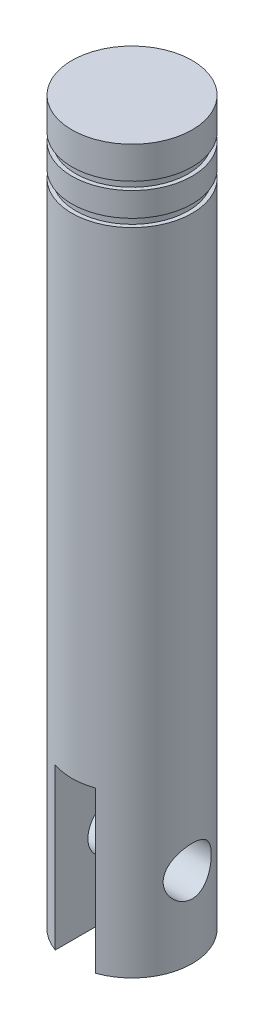
ISO-10303-21;
HEADER;
FILE_DESCRIPTION(('STEP AP214'),'2;1');
FILE_NAME('part.step','',(''),(''),'','','');
FILE_SCHEMA(('AUTOMOTIVE_DESIGN { 1 0 10303 214 1 1 1 1 }'));
ENDSEC;
DATA;
#1=APPLICATION_CONTEXT('core data for automotive mechanical design processes');
#2=APPLICATION_PROTOCOL_DEFINITION('international standard','automotive_design',2000,#1);
#3=PRODUCT_CONTEXT('',#1,'mechanical');
#4=PRODUCT('Part','Part','',(#3));
#5=PRODUCT_RELATED_PRODUCT_CATEGORY('part','',(#4));
#6=PRODUCT_DEFINITION_FORMATION('','',#4);
#7=PRODUCT_DEFINITION_CONTEXT('part definition',#1,'design');
#8=PRODUCT_DEFINITION('design','',#6,#7);
#9=PRODUCT_DEFINITION_SHAPE('','',#8);
#10=(LENGTH_UNIT() NAMED_UNIT(*) SI_UNIT(.MILLI.,.METRE.));
#11=(NAMED_UNIT(*) PLANE_ANGLE_UNIT() SI_UNIT($,.RADIAN.));
#12=(NAMED_UNIT(*) SI_UNIT($,.STERADIAN.) SOLID_ANGLE_UNIT());
#13=UNCERTAINTY_MEASURE_WITH_UNIT(LENGTH_MEASURE(1.E-05),#10,'distance_accuracy_value','');
#14=(GEOMETRIC_REPRESENTATION_CONTEXT(3) GLOBAL_UNCERTAINTY_ASSIGNED_CONTEXT((#13)) GLOBAL_UNIT_ASSIGNED_CONTEXT((#10,
#11,#12)) REPRESENTATION_CONTEXT('',''));
#15=CARTESIAN_POINT('',(0.,0.,0.));
#16=DIRECTION('',(0.,0.,1.));
#17=DIRECTION('',(1.,0.,0.));
#18=AXIS2_PLACEMENT_3D('',#15,#16,#17);
#19=CARTESIAN_POINT('',(-7.5,-45.,0.));
#20=DIRECTION('',(0.,1.,0.));
#21=DIRECTION('',(-1.,0.,0.));
#22=AXIS2_PLACEMENT_3D('',#19,#20,#21);
#23=PLANE('',#22);
#24=CARTESIAN_POINT('',(0.,-45.,0.));
#25=DIRECTION('',(0.,-1.,0.));
#26=DIRECTION('',(1.,0.,0.));
#27=AXIS2_PLACEMENT_3D('',#24,#25,#26);
#28=CIRCLE('',#27,7.5);
#29=CARTESIAN_POINT('',(-2.50000000000002,-45.,7.07106781186547));
#30=VERTEX_POINT('',#29);
#31=CARTESIAN_POINT('',(-2.50000000000002,-45.,-7.07106781186547));
#32=VERTEX_POINT('',#31);
#33=EDGE_CURVE('E91',#30,#32,#28,.T.);
#34=ORIENTED_EDGE('',*,*,#33,.T.);
#35=DIRECTION('',(0.,0.,1.));
#36=VECTOR('',#35,1.);
#37=CARTESIAN_POINT('',(-2.50000000000002,-45.,-7.5));
#38=LINE('',#37,#36);
#39=EDGE_CURVE('E76',#32,#30,#38,.T.);
#40=ORIENTED_EDGE('',*,*,#39,.T.);
#41=EDGE_LOOP('',(#34,#40));
#42=FACE_BOUND('',#41,.T.);
#43=ADVANCED_FACE('F35',(#42),#23,.F.);
#44=CARTESIAN_POINT('',(-7.50000000000002,41.,0.));
#45=DIRECTION('',(0.,1.,0.));
#46=DIRECTION('',(-1.,0.,0.));
#47=AXIS2_PLACEMENT_3D('',#44,#45,#46);
#48=PLANE('',#47);
#49=CARTESIAN_POINT('',(0.,41.,0.));
#50=DIRECTION('',(0.,-1.,0.));
#51=DIRECTION('',(1.,0.,0.));
#52=AXIS2_PLACEMENT_3D('',#49,#50,#51);
#53=CIRCLE('',#52,6.99999999999999);
#54=CARTESIAN_POINT('',(6.99999999999997,41.,0.));
#55=VERTEX_POINT('',#54);
#56=EDGE_CURVE('E122',#55,#55,#53,.T.);
#57=ORIENTED_EDGE('',*,*,#56,.F.);
#58=EDGE_LOOP('',(#57));
#59=FACE_BOUND('',#58,.T.);
#60=CARTESIAN_POINT('',(0.,41.,0.));
#61=DIRECTION('',(0.,-1.,0.));
#62=DIRECTION('',(1.,0.,0.));
#63=AXIS2_PLACEMENT_3D('',#60,#61,#62);
#64=CIRCLE('',#63,7.5);
#65=CARTESIAN_POINT('',(7.49999999999998,41.,0.));
#66=VERTEX_POINT('',#65);
#67=EDGE_CURVE('E98',#66,#66,#64,.T.);
#68=ORIENTED_EDGE('',*,*,#67,.T.);
#69=EDGE_LOOP('',(#68));
#70=FACE_BOUND('',#69,.T.);
#71=ADVANCED_FACE('F37',(#59,#70),#48,.F.);
#72=CARTESIAN_POINT('',(0.,-45.,0.));
#73=DIRECTION('',(0.,-1.,0.));
#74=DIRECTION('',(1.,0.,0.));
#75=AXIS2_PLACEMENT_3D('',#72,#73,#74);
#76=CYLINDRICAL_SURFACE('',#75,7.5);
#77=ORIENTED_EDGE('',*,*,#67,.F.);
#78=EDGE_LOOP('',(#77));
#79=FACE_BOUND('',#78,.T.);
#80=CARTESIAN_POINT('',(0.,45.,0.));
#81=DIRECTION('',(0.,-1.,0.));
#82=DIRECTION('',(1.,0.,0.));
#83=AXIS2_PLACEMENT_3D('',#80,#81,#82);
#84=CIRCLE('',#83,7.5);
#85=CARTESIAN_POINT('',(7.49999999999998,45.,0.));
#86=VERTEX_POINT('',#85);
#87=EDGE_CURVE('E94',#86,#86,#84,.T.);
#88=ORIENTED_EDGE('',*,*,#87,.T.);
#89=EDGE_LOOP('',(#88));
#90=FACE_BOUND('',#89,.T.);
#91=ADVANCED_FACE('F161',(#79,#90),#76,.T.);
#92=CARTESIAN_POINT('',(0.,45.,0.));
#93=DIRECTION('',(0.,-1.,0.));
#94=DIRECTION('',(1.,0.,0.));
#95=AXIS2_PLACEMENT_3D('',#92,#93,#94);
#96=PLANE('',#95);
#97=ORIENTED_EDGE('',*,*,#87,.F.);
#98=EDGE_LOOP('',(#97));
#99=FACE_BOUND('',#98,.T.);
#100=ADVANCED_FACE('F165',(#99),#96,.F.);
#101=CARTESIAN_POINT('',(2.49999999999999,-45.,-7.07106781186548));
#102=VERTEX_POINT('',#101);
#103=CARTESIAN_POINT('',(2.49999999999999,-45.,7.07106781186548));
#104=VERTEX_POINT('',#103);
#105=EDGE_CURVE('E95',#102,#104,#28,.T.);
#106=ORIENTED_EDGE('',*,*,#105,.T.);
#107=DIRECTION('',(0.,0.,1.));
#108=VECTOR('',#107,1.);
#109=CARTESIAN_POINT('',(2.49999999999999,-45.,-7.5));
#110=LINE('',#109,#108);
#111=EDGE_CURVE('E85',#102,#104,#110,.T.);
#112=ORIENTED_EDGE('',*,*,#111,.F.);
#113=EDGE_LOOP('',(#106,#112));
#114=FACE_BOUND('',#113,.T.);
#115=ADVANCED_FACE('F116',(#114),#23,.F.);
#116=CARTESIAN_POINT('',(0.,-45.,0.));
#117=DIRECTION('',(0.,-1.,0.));
#118=DIRECTION('',(1.,0.,0.));
#119=AXIS2_PLACEMENT_3D('',#116,#117,#118);
#120=CYLINDRICAL_SURFACE('',#119,7.5);
#121=CARTESIAN_POINT('',(-7.50000000000002,-38.,0.));
#122=CARTESIAN_POINT('',(-7.49999888970474,-37.9999983890229,-0.0806632009395351));
#123=CARTESIAN_POINT('',(-7.49869368950071,-37.99674011548,-0.161354413498371));
#124=CARTESIAN_POINT('',(-7.49351186176526,-37.9837470954671,-0.322146094522251));
#125=CARTESIAN_POINT('',(-7.48963361174619,-37.9740082625401,-0.40224615798198));
#126=CARTESIAN_POINT('',(-7.47424634808758,-37.9351288598822,-0.641096781067451));
#127=CARTESIAN_POINT('',(-7.45898522266243,-37.8963256924552,-0.798158082521719));
#128=CARTESIAN_POINT('',(-7.42011459126984,-37.7946857721891,-1.1024703389988));
#129=CARTESIAN_POINT('',(-7.39653243529675,-37.7319277009698,-1.24975157753076));
#130=CARTESIAN_POINT('',(-7.3433487722407,-37.584471269705,-1.53159737405796));
#131=CARTESIAN_POINT('',(-7.31374935540466,-37.4997805257342,-1.66616632427491));
#132=CARTESIAN_POINT('',(-7.24996340359365,-37.3066467436976,-1.92525452632722));
#133=CARTESIAN_POINT('',(-7.2156344837394,-37.1973400133687,-2.04909421803168));
#134=CARTESIAN_POINT('',(-7.14690862377685,-36.9598999970569,-2.27726169757605));
#135=CARTESIAN_POINT('',(-7.11251165865922,-36.8317575548035,-2.38157993941976));
#136=CARTESIAN_POINT('',(-7.04584188546733,-36.5533578939878,-2.5723120820679));
#137=CARTESIAN_POINT('',(-7.01373174174386,-36.4023702707912,-2.65772253361338));
#138=CARTESIAN_POINT('',(-6.95750470553339,-36.0866954025439,-2.80163201676496));
#139=CARTESIAN_POINT('',(-6.93338401809298,-35.9220147082749,-2.86014383023324));
#140=CARTESIAN_POINT('',(-6.89739536545611,-35.5914314995665,-2.94584825055478));
#141=CARTESIAN_POINT('',(-6.88502130539266,-35.4259231466171,-2.974340952837));
#142=CARTESIAN_POINT('',(-6.87246006067861,-35.0920475025576,-3.00325943833355));
#143=CARTESIAN_POINT('',(-6.87226688315068,-34.9236816580913,-3.00369902341367));
#144=CARTESIAN_POINT('',(-6.88365750391268,-34.6013649927747,-2.97748405223856));
#145=CARTESIAN_POINT('',(-6.89442262441714,-34.4472264282761,-2.95271297167583));
#146=CARTESIAN_POINT('',(-6.92514281294202,-34.1455106658869,-2.87992032013237));
#147=CARTESIAN_POINT('',(-6.94509948450628,-33.9979346178108,-2.83189469212407));
#148=CARTESIAN_POINT('',(-6.99239227665172,-33.7099732457397,-2.71304209891513));
#149=CARTESIAN_POINT('',(-7.0198706892988,-33.569796141427,-2.64176979349676));
#150=CARTESIAN_POINT('',(-7.07907174576134,-33.3028762754486,-2.47875969107453));
#151=CARTESIAN_POINT('',(-7.11079598182861,-33.1761385858933,-2.38701420764467));
#152=CARTESIAN_POINT('',(-7.17790105116005,-32.9293854067997,-2.17732589918876));
#153=CARTESIAN_POINT('',(-7.21337497464925,-32.8106469058317,-2.05790619445786));
#154=CARTESIAN_POINT('',(-7.28189737436727,-32.5944732829962,-1.80047164114339));
#155=CARTESIAN_POINT('',(-7.31494536667799,-32.4970424038844,-1.66245309800114));
#156=CARTESIAN_POINT('',(-7.37572021897015,-32.3245738288764,-1.3681164789093));
#157=CARTESIAN_POINT('',(-7.40332905143174,-32.2500165782045,-1.21149073701986));
#158=CARTESIAN_POINT('',(-7.44922242493088,-32.1287482083829,-0.88653564822419));
#159=CARTESIAN_POINT('',(-7.46751170193561,-32.0820229436639,-0.718212295274483));
#160=CARTESIAN_POINT('',(-7.49184209260379,-32.0203275568705,-0.385343831411762));
#161=CARTESIAN_POINT('',(-7.49854418750275,-32.0036413186196,-0.221164940978296));
#162=CARTESIAN_POINT('',(-7.50102717765944,-31.9974303492071,0.107767964711716));
#163=CARTESIAN_POINT('',(-7.49681090373438,-32.0078985776787,0.272521819835822));
#164=CARTESIAN_POINT('',(-7.4783635059563,-32.054437628828,0.59014910868304));
#165=CARTESIAN_POINT('',(-7.46459087018284,-32.0893369705264,0.743223737663436));
#166=CARTESIAN_POINT('',(-7.42889162108252,-32.1821535624648,1.04120314209094));
#167=CARTESIAN_POINT('',(-7.40696396034804,-32.2400737695033,1.18610686533642));
#168=CARTESIAN_POINT('',(-7.35624892156211,-32.3791774095196,1.46861817872592));
#169=CARTESIAN_POINT('',(-7.32727223969677,-32.4610182080636,1.60586703413639));
#170=CARTESIAN_POINT('',(-7.26560047118316,-32.6449104858595,1.86516538686655));
#171=CARTESIAN_POINT('',(-7.23290389665513,-32.746970064388,1.98720876112943));
#172=CARTESIAN_POINT('',(-7.16467676457054,-32.9763050194201,2.22108456455631));
#173=CARTESIAN_POINT('',(-7.1291016213714,-33.1048003122427,2.3317109007594));
#174=CARTESIAN_POINT('',(-7.06112509376138,-33.3791601245307,2.53012679607026));
#175=CARTESIAN_POINT('',(-7.02872423291409,-33.5250275005721,2.6179125918181));
#176=CARTESIAN_POINT('',(-6.97071449859906,-33.8321925418284,2.76871125308743));
#177=CARTESIAN_POINT('',(-6.94517446320967,-33.993625998583,2.83147589251401));
#178=CARTESIAN_POINT('',(-6.90485510223109,-34.326100477808,2.92844432884615));
#179=CARTESIAN_POINT('',(-6.89006783567177,-34.4971343095966,2.96266920524751));
#180=CARTESIAN_POINT('',(-6.87407638928379,-34.830691851847,2.9995734283829));
#181=CARTESIAN_POINT('',(-6.87197131434659,-34.9929422564508,3.00434563234764));
#182=CARTESIAN_POINT('',(-6.87922254127235,-35.3158172895088,2.98770473002408));
#183=CARTESIAN_POINT('',(-6.88857738776019,-35.4764421217941,2.96629494876878));
#184=CARTESIAN_POINT('',(-6.91689973341125,-35.784998274275,2.89960708102334));
#185=CARTESIAN_POINT('',(-6.93547246725062,-35.9331803731612,2.85530635681061));
#186=CARTESIAN_POINT('',(-6.97986002865438,-36.2200679829191,2.7450080562502));
#187=CARTESIAN_POINT('',(-7.00567685597585,-36.3587708638532,2.67900448789151));
#188=CARTESIAN_POINT('',(-7.06347910401243,-36.6314142771862,2.52280960319953));
#189=CARTESIAN_POINT('',(-7.09573308125318,-36.7646274239758,2.43144976133989));
#190=CARTESIAN_POINT('',(-7.16195721907533,-37.014490557201,2.2288364197758));
#191=CARTESIAN_POINT('',(-7.1959278947067,-37.1311355323133,2.1175769239766));
#192=CARTESIAN_POINT('',(-7.2644028951161,-37.3523019648148,1.86976526416226));
#193=CARTESIAN_POINT('',(-7.29879901943986,-37.4555470590559,1.73204093441049));
#194=CARTESIAN_POINT('',(-7.36200845178942,-37.6375144693551,1.43982353523661));
#195=CARTESIAN_POINT('',(-7.39081916114846,-37.7162253809562,1.28532271229705));
#196=CARTESIAN_POINT('',(-7.42714827886078,-37.8130735008888,1.04589046292377));
#197=CARTESIAN_POINT('',(-7.438042523706,-37.841655970124,0.965550642326299));
#198=CARTESIAN_POINT('',(-7.45739623794253,-37.8919376582943,0.802472015195128));
#199=CARTESIAN_POINT('',(-7.46585684248286,-37.9136400868448,0.719734347003784));
#200=CARTESIAN_POINT('',(-7.48007543500346,-37.9498820309638,0.552707555877389));
#201=CARTESIAN_POINT('',(-7.48584027408326,-37.9644397091379,0.468422937872988));
#202=CARTESIAN_POINT('',(-7.49452509406316,-37.9863036527915,0.298814608941239));
#203=CARTESIAN_POINT('',(-7.49744709693401,-37.9936150722507,0.213491680311736));
#204=CARTESIAN_POINT('',(-7.49963590220857,-37.9990895204053,0.0853730051865994));
#205=CARTESIAN_POINT('',(-7.50000058761589,-38.0000008525982,0.0426904255930861));
#206=CARTESIAN_POINT('',(-7.50000000000002,-38.,0.));
#207=B_SPLINE_CURVE_WITH_KNOTS('',3,(#121,#122,#123,#124,#125,#126,#127,#128,#129,#130,#131,
#132,#133,#134,#135,#136,#137,#138,#139,#140,#141,#142,#143,#144,#145,#146,#147,#148,#149,#150,
#151,#152,#153,#154,#155,#156,#157,#158,#159,#160,#161,#162,#163,#164,#165,#166,#167,#168,#169,
#170,#171,#172,#173,#174,#175,#176,#177,#178,#179,#180,#181,#182,#183,#184,#185,#186,#187,#188,
#189,#190,#191,#192,#193,#194,#195,#196,#197,#198,#199,#200,#201,#202,#203,#204,#205,#206),
.UNSPECIFIED.,.T.,.F.,(4,2,2,2,2,2,2,2,2,2,2,2,2,2,2,2,2,2,2,2,2,2,2,2,2,2,2,2,2,2,2,2,2,2,2,2,
2,2,2,2,2,2,4),(0.,0.241952995066614,0.484058703589859,0.968979675762155,1.45232140795762,
1.93549552527002,2.43941494725621,2.94358014576643,3.47018310403851,3.99653556852428,
4.49901580138269,5.00124881685758,5.46852914780512,5.93589103065598,6.4127911162975,
6.88987055088801,7.40382945961361,7.91789061441125,8.44210791925736,8.96605856352212,
9.45899198973538,9.9517976253665,10.4224610552808,10.8931849567222,11.3783069227892,
11.8636236142998,12.3809813411815,12.8984242574715,13.4208798989277,13.9429493115043,
14.4274493227065,14.911887810261,15.3771690000468,15.8425787588927,16.3346362426657,
16.8268422420412,17.3509605748228,17.8753221764233,18.1329380344125,18.3904335342851,
18.6472710222664,18.9039257004316,19.0319776028183),.UNSPECIFIED.);
#208=CARTESIAN_POINT('',(-7.50000000000002,-38.,0.));
#209=VERTEX_POINT('',#208);
#210=EDGE_CURVE('E307',#209,#209,#207,.T.);
#211=ORIENTED_EDGE('',*,*,#210,.T.);
#212=EDGE_LOOP('',(#211));
#213=FACE_BOUND('',#212,.T.);
#214=CARTESIAN_POINT('',(7.5,-32.,0.));
#215=CARTESIAN_POINT('',(7.49999888970472,-32.0000016109771,-0.0806632009395355));
#216=CARTESIAN_POINT('',(7.49869368950069,-32.00325988452,-0.161354413498372));
#217=CARTESIAN_POINT('',(7.49351186176526,-32.0162529045329,-0.322146094522252));
#218=CARTESIAN_POINT('',(7.48963361174618,-32.0259917374599,-0.402246157981982));
#219=CARTESIAN_POINT('',(7.47424634808757,-32.0648711401178,-0.641096781067452));
#220=CARTESIAN_POINT('',(7.45898522266242,-32.1036743075448,-0.798158082521719));
#221=CARTESIAN_POINT('',(7.42011459126983,-32.2053142278109,-1.1024703389988));
#222=CARTESIAN_POINT('',(7.39653243529674,-32.2680722990302,-1.24975157753076));
#223=CARTESIAN_POINT('',(7.34334877224069,-32.415528730295,-1.53159737405796));
#224=CARTESIAN_POINT('',(7.31374935540466,-32.5002194742658,-1.66616632427491));
#225=CARTESIAN_POINT('',(7.24996340359364,-32.6933532563024,-1.92525452632722));
#226=CARTESIAN_POINT('',(7.21563448373939,-32.8026599866313,-2.04909421803168));
#227=CARTESIAN_POINT('',(7.14690862377684,-33.0401000029431,-2.27726169757605));
#228=CARTESIAN_POINT('',(7.11251165865921,-33.1682424451965,-2.38157993941976));
#229=CARTESIAN_POINT('',(7.04584188546732,-33.4466421060121,-2.5723120820679));
#230=CARTESIAN_POINT('',(7.01373174174385,-33.5976297292088,-2.65772253361338));
#231=CARTESIAN_POINT('',(6.95750470553338,-33.9133045974561,-2.80163201676496));
#232=CARTESIAN_POINT('',(6.93338401809297,-34.0779852917251,-2.86014383023324));
#233=CARTESIAN_POINT('',(6.8973953654561,-34.4085685004334,-2.94584825055478));
#234=CARTESIAN_POINT('',(6.88502130539265,-34.5740768533829,-2.974340952837));
#235=CARTESIAN_POINT('',(6.87246006067861,-34.9079524974424,-3.00325943833355));
#236=CARTESIAN_POINT('',(6.87226688315067,-35.0763183419086,-3.00369902341367));
#237=CARTESIAN_POINT('',(6.88365750391267,-35.3986350072253,-2.97748405223856));
#238=CARTESIAN_POINT('',(6.89442262441713,-35.5527735717239,-2.95271297167583));
#239=CARTESIAN_POINT('',(6.92514281294201,-35.8544893341131,-2.87992032013237));
#240=CARTESIAN_POINT('',(6.94509948450627,-36.0020653821892,-2.83189469212407));
#241=CARTESIAN_POINT('',(6.99239227665171,-36.2900267542603,-2.71304209891513));
#242=CARTESIAN_POINT('',(7.01987068929879,-36.430203858573,-2.64176979349676));
#243=CARTESIAN_POINT('',(7.07907174576133,-36.6971237245514,-2.47875969107453));
#244=CARTESIAN_POINT('',(7.1107959818286,-36.8238614141067,-2.38701420764467));
#245=CARTESIAN_POINT('',(7.17790105116004,-37.0706145932003,-2.17732589918876));
#246=CARTESIAN_POINT('',(7.21337497464924,-37.1893530941683,-2.05790619445786));
#247=CARTESIAN_POINT('',(7.28189737436726,-37.4055267170038,-1.80047164114339));
#248=CARTESIAN_POINT('',(7.31494536667798,-37.5029575961156,-1.66245309800114));
#249=CARTESIAN_POINT('',(7.37572021897014,-37.6754261711235,-1.3681164789093));
#250=CARTESIAN_POINT('',(7.40332905143173,-37.7499834217955,-1.21149073701986));
#251=CARTESIAN_POINT('',(7.44922242493087,-37.8712517916171,-0.886535648224189));
#252=CARTESIAN_POINT('',(7.4675117019356,-37.9179770563361,-0.718212295274483));
#253=CARTESIAN_POINT('',(7.49184209260378,-37.9796724431295,-0.385343831411762));
#254=CARTESIAN_POINT('',(7.49854418750274,-37.9963586813803,-0.221164940978296));
#255=CARTESIAN_POINT('',(7.50102717765943,-38.0025696507929,0.107767964711716));
#256=CARTESIAN_POINT('',(7.49681090373437,-37.9921014223212,0.272521819835822));
#257=CARTESIAN_POINT('',(7.4783635059563,-37.945562371172,0.590149108683039));
#258=CARTESIAN_POINT('',(7.46459087018283,-37.9106630294736,0.743223737663435));
#259=CARTESIAN_POINT('',(7.42889162108251,-37.8178464375352,1.04120314209094));
#260=CARTESIAN_POINT('',(7.40696396034803,-37.7599262304967,1.18610686533642));
#261=CARTESIAN_POINT('',(7.3562489215621,-37.6208225904804,1.46861817872592));
#262=CARTESIAN_POINT('',(7.32727223969676,-37.5389817919364,1.60586703413639));
#263=CARTESIAN_POINT('',(7.26560047118315,-37.3550895141404,1.86516538686655));
#264=CARTESIAN_POINT('',(7.23290389665512,-37.253029935612,1.98720876112942));
#265=CARTESIAN_POINT('',(7.16467676457053,-37.0236949805799,2.2210845645563));
#266=CARTESIAN_POINT('',(7.12910162137139,-36.8951996877573,2.3317109007594));
#267=CARTESIAN_POINT('',(7.06112509376137,-36.6208398754693,2.53012679607026));
#268=CARTESIAN_POINT('',(7.02872423291408,-36.4749724994279,2.6179125918181));
#269=CARTESIAN_POINT('',(6.97071449859905,-36.1678074581716,2.76871125308743));
#270=CARTESIAN_POINT('',(6.94517446320966,-36.006374001417,2.83147589251401));
#271=CARTESIAN_POINT('',(6.90485510223108,-35.673899522192,2.92844432884615));
#272=CARTESIAN_POINT('',(6.89006783567176,-35.5028656904034,2.96266920524751));
#273=CARTESIAN_POINT('',(6.87407638928378,-35.169308148153,2.9995734283829));
#274=CARTESIAN_POINT('',(6.87197131434659,-35.0070577435492,3.00434563234764));
#275=CARTESIAN_POINT('',(6.87922254127235,-34.6841827104912,2.98770473002408));
#276=CARTESIAN_POINT('',(6.88857738776018,-34.5235578782059,2.96629494876878));
#277=CARTESIAN_POINT('',(6.91689973341124,-34.215001725725,2.89960708102334));
#278=CARTESIAN_POINT('',(6.93547246725061,-34.0668196268387,2.85530635681061));
#279=CARTESIAN_POINT('',(6.97986002865438,-33.7799320170809,2.7450080562502));
#280=CARTESIAN_POINT('',(7.00567685597584,-33.6412291361468,2.67900448789151));
#281=CARTESIAN_POINT('',(7.06347910401242,-33.3685857228138,2.52280960319953));
#282=CARTESIAN_POINT('',(7.09573308125317,-33.2353725760242,2.43144976133989));
#283=CARTESIAN_POINT('',(7.16195721907533,-32.985509442799,2.2288364197758));
#284=CARTESIAN_POINT('',(7.1959278947067,-32.8688644676867,2.1175769239766));
#285=CARTESIAN_POINT('',(7.26440289511609,-32.6476980351852,1.86976526416226));
#286=CARTESIAN_POINT('',(7.29879901943985,-32.544452940944,1.73204093441049));
#287=CARTESIAN_POINT('',(7.36200845178942,-32.3624855306449,1.43982353523661));
#288=CARTESIAN_POINT('',(7.39081916114845,-32.2837746190438,1.28532271229705));
#289=CARTESIAN_POINT('',(7.42714827886077,-32.1869264991112,1.04589046292377));
#290=CARTESIAN_POINT('',(7.438042523706,-32.158344029876,0.965550642326299));
#291=CARTESIAN_POINT('',(7.45739623794252,-32.1080623417057,0.802472015195128));
#292=CARTESIAN_POINT('',(7.46585684248285,-32.0863599131552,0.719734347003783));
#293=CARTESIAN_POINT('',(7.48007543500346,-32.0501179690362,0.552707555877388));
#294=CARTESIAN_POINT('',(7.48584027408325,-32.0355602908621,0.468422937872989));
#295=CARTESIAN_POINT('',(7.49452509406316,-32.0136963472085,0.29881460894124));
#296=CARTESIAN_POINT('',(7.49744709693401,-32.0063849277493,0.213491680311737));
#297=CARTESIAN_POINT('',(7.49963590220856,-32.0009104795947,0.0853730051866004));
#298=CARTESIAN_POINT('',(7.50000058761588,-31.9999991474018,0.0426904255930866));
#299=CARTESIAN_POINT('',(7.5,-32.,0.));
#300=B_SPLINE_CURVE_WITH_KNOTS('',3,(#214,#215,#216,#217,#218,#219,#220,#221,#222,#223,#224,
#225,#226,#227,#228,#229,#230,#231,#232,#233,#234,#235,#236,#237,#238,#239,#240,#241,#242,#243,
#244,#245,#246,#247,#248,#249,#250,#251,#252,#253,#254,#255,#256,#257,#258,#259,#260,#261,#262,
#263,#264,#265,#266,#267,#268,#269,#270,#271,#272,#273,#274,#275,#276,#277,#278,#279,#280,#281,
#282,#283,#284,#285,#286,#287,#288,#289,#290,#291,#292,#293,#294,#295,#296,#297,#298,#299),
.UNSPECIFIED.,.T.,.F.,(4,2,2,2,2,2,2,2,2,2,2,2,2,2,2,2,2,2,2,2,2,2,2,2,2,2,2,2,2,2,2,2,2,2,2,2,
2,2,2,2,2,2,4),(0.,0.241952995066615,0.48405870358986,0.968979675762156,1.45232140795762,
1.93549552527002,2.43941494725621,2.94358014576643,3.47018310403851,3.99653556852428,
4.49901580138269,5.00124881685758,5.46852914780512,5.93589103065598,6.4127911162975,
6.88987055088801,7.40382945961361,7.91789061441125,8.44210791925736,8.96605856352212,
9.45899198973538,9.9517976253665,10.4224610552808,10.8931849567222,11.3783069227892,
11.8636236142998,12.3809813411815,12.8984242574715,13.4208798989277,13.9429493115043,
14.4274493227065,14.911887810261,15.3771690000468,15.8425787588927,16.3346362426657,
16.8268422420412,17.3509605748228,17.8753221764233,18.1329380344125,18.3904335342851,
18.6472710222664,18.9039257004316,19.0319776028183),.UNSPECIFIED.);
#301=CARTESIAN_POINT('',(7.5,-32.,0.));
#302=VERTEX_POINT('',#301);
#303=EDGE_CURVE('E86',#302,#302,#300,.T.);
#304=ORIENTED_EDGE('',*,*,#303,.T.);
#305=EDGE_LOOP('',(#304));
#306=FACE_BOUND('',#305,.T.);
#307=CARTESIAN_POINT('',(0.,-25.,0.));
#308=DIRECTION('',(0.,1.,0.));
#309=DIRECTION('',(0.,0.,1.));
#310=AXIS2_PLACEMENT_3D('',#307,#308,#309);
#311=CIRCLE('',#310,7.5);
#312=CARTESIAN_POINT('',(-2.50000000000002,-25.,7.07106781186547));
#313=VERTEX_POINT('',#312);
#314=CARTESIAN_POINT('',(2.49999999999998,-25.,7.07106781186548));
#315=VERTEX_POINT('',#314);
#316=EDGE_CURVE('E56',#313,#315,#311,.T.);
#317=ORIENTED_EDGE('',*,*,#316,.T.);
#318=DIRECTION('',(0.,-1.,0.));
#319=VECTOR('',#318,1.);
#320=CARTESIAN_POINT('',(2.49999999999999,-45.,7.07106781186548));
#321=LINE('',#320,#319);
#322=EDGE_CURVE('E11',#315,#104,#321,.T.);
#323=ORIENTED_EDGE('',*,*,#322,.T.);
#324=ORIENTED_EDGE('',*,*,#105,.F.);
#325=DIRECTION('',(0.,-1.,0.));
#326=VECTOR('',#325,1.);
#327=CARTESIAN_POINT('',(2.49999999999999,-45.,-7.07106781186548));
#328=LINE('',#327,#326);
#329=CARTESIAN_POINT('',(2.49999999999999,-25.,-7.07106781186548));
#330=VERTEX_POINT('',#329);
#331=EDGE_CURVE('E44',#102,#330,#328,.F.);
#332=ORIENTED_EDGE('',*,*,#331,.T.);
#333=CARTESIAN_POINT('',(-2.50000000000002,-25.,-7.07106781186547));
#334=VERTEX_POINT('',#333);
#335=EDGE_CURVE('E51',#330,#334,#311,.T.);
#336=ORIENTED_EDGE('',*,*,#335,.T.);
#337=DIRECTION('',(0.,-1.,0.));
#338=VECTOR('',#337,1.);
#339=CARTESIAN_POINT('',(-2.50000000000002,-45.,-7.07106781186547));
#340=LINE('',#339,#338);
#341=EDGE_CURVE('E79',#334,#32,#340,.T.);
#342=ORIENTED_EDGE('',*,*,#341,.T.);
#343=ORIENTED_EDGE('',*,*,#33,.F.);
#344=DIRECTION('',(0.,-1.,0.));
#345=VECTOR('',#344,1.);
#346=CARTESIAN_POINT('',(-2.50000000000002,-45.,7.07106781186547));
#347=LINE('',#346,#345);
#348=EDGE_CURVE('E81',#30,#313,#347,.F.);
#349=ORIENTED_EDGE('',*,*,#348,.T.);
#350=EDGE_LOOP('',(#317,#323,#324,#332,#336,#342,#343,#349));
#351=FACE_BOUND('',#350,.T.);
#352=CARTESIAN_POINT('',(0.,36.,0.));
#353=DIRECTION('',(0.,-1.,0.));
#354=DIRECTION('',(1.,0.,0.));
#355=AXIS2_PLACEMENT_3D('',#352,#353,#354);
#356=CIRCLE('',#355,7.5);
#357=CARTESIAN_POINT('',(7.49999999999998,36.,0.));
#358=VERTEX_POINT('',#357);
#359=EDGE_CURVE('E101',#358,#358,#356,.T.);
#360=ORIENTED_EDGE('',*,*,#359,.T.);
#361=EDGE_LOOP('',(#360));
#362=FACE_BOUND('',#361,.T.);
#363=ADVANCED_FACE('F89',(#213,#306,#351,#362),#120,.T.);
#364=CARTESIAN_POINT('',(-7.,36.,0.));
#365=DIRECTION('',(0.,-1.,0.));
#366=DIRECTION('',(1.,0.,0.));
#367=AXIS2_PLACEMENT_3D('',#364,#365,#366);
#368=PLANE('',#367);
#369=ORIENTED_EDGE('',*,*,#359,.F.);
#370=EDGE_LOOP('',(#369));
#371=FACE_BOUND('',#370,.T.);
#372=CARTESIAN_POINT('',(0.,36.,0.));
#373=DIRECTION('',(0.,-1.,0.));
#374=DIRECTION('',(1.,0.,0.));
#375=AXIS2_PLACEMENT_3D('',#372,#373,#374);
#376=CIRCLE('',#375,6.99999999999999);
#377=CARTESIAN_POINT('',(6.99999999999997,36.,0.));
#378=VERTEX_POINT('',#377);
#379=EDGE_CURVE('E136',#378,#378,#376,.T.);
#380=ORIENTED_EDGE('',*,*,#379,.T.);
#381=EDGE_LOOP('',(#380));
#382=FACE_BOUND('',#381,.T.);
#383=ADVANCED_FACE('F143',(#371,#382),#368,.F.);
#384=CARTESIAN_POINT('',(0.,-45.,0.));
#385=DIRECTION('',(0.,-1.,0.));
#386=DIRECTION('',(1.,0.,0.));
#387=AXIS2_PLACEMENT_3D('',#384,#385,#386);
#388=CYLINDRICAL_SURFACE('',#387,6.99999999999999);
#389=ORIENTED_EDGE('',*,*,#379,.F.);
#390=EDGE_LOOP('',(#389));
#391=FACE_BOUND('',#390,.T.);
#392=CARTESIAN_POINT('',(0.,37.,0.));
#393=DIRECTION('',(0.,-1.,0.));
#394=DIRECTION('',(1.,0.,0.));
#395=AXIS2_PLACEMENT_3D('',#392,#393,#394);
#396=CIRCLE('',#395,6.99999999999999);
#397=CARTESIAN_POINT('',(6.99999999999997,37.,0.));
#398=VERTEX_POINT('',#397);
#399=EDGE_CURVE('E134',#398,#398,#396,.T.);
#400=ORIENTED_EDGE('',*,*,#399,.T.);
#401=EDGE_LOOP('',(#400));
#402=FACE_BOUND('',#401,.T.);
#403=ADVANCED_FACE('F145',(#391,#402),#388,.T.);
#404=CARTESIAN_POINT('',(-7.50000000000002,37.,0.));
#405=DIRECTION('',(0.,1.,0.));
#406=DIRECTION('',(-1.,0.,0.));
#407=AXIS2_PLACEMENT_3D('',#404,#405,#406);
#408=PLANE('',#407);
#409=ORIENTED_EDGE('',*,*,#399,.F.);
#410=EDGE_LOOP('',(#409));
#411=FACE_BOUND('',#410,.T.);
#412=CARTESIAN_POINT('',(0.,37.,0.));
#413=DIRECTION('',(0.,-1.,0.));
#414=DIRECTION('',(1.,0.,0.));
#415=AXIS2_PLACEMENT_3D('',#412,#413,#414);
#416=CIRCLE('',#415,7.5);
#417=CARTESIAN_POINT('',(7.49999999999998,37.,0.));
#418=VERTEX_POINT('',#417);
#419=EDGE_CURVE('E131',#418,#418,#416,.T.);
#420=ORIENTED_EDGE('',*,*,#419,.T.);
#421=EDGE_LOOP('',(#420));
#422=FACE_BOUND('',#421,.T.);
#423=ADVANCED_FACE('F151',(#411,#422),#408,.F.);
#424=CARTESIAN_POINT('',(0.,-45.,0.));
#425=DIRECTION('',(0.,-1.,0.));
#426=DIRECTION('',(1.,0.,0.));
#427=AXIS2_PLACEMENT_3D('',#424,#425,#426);
#428=CYLINDRICAL_SURFACE('',#427,7.5);
#429=ORIENTED_EDGE('',*,*,#419,.F.);
#430=EDGE_LOOP('',(#429));
#431=FACE_BOUND('',#430,.T.);
#432=CARTESIAN_POINT('',(0.,40.,0.));
#433=DIRECTION('',(0.,-1.,0.));
#434=DIRECTION('',(1.,0.,0.));
#435=AXIS2_PLACEMENT_3D('',#432,#433,#434);
#436=CIRCLE('',#435,7.5);
#437=CARTESIAN_POINT('',(7.49999999999998,40.,0.));
#438=VERTEX_POINT('',#437);
#439=EDGE_CURVE('E128',#438,#438,#436,.T.);
#440=ORIENTED_EDGE('',*,*,#439,.T.);
#441=EDGE_LOOP('',(#440));
#442=FACE_BOUND('',#441,.T.);
#443=ADVANCED_FACE('F220',(#431,#442),#428,.T.);
#444=CARTESIAN_POINT('',(-7.,40.,0.));
#445=DIRECTION('',(0.,-1.,0.));
#446=DIRECTION('',(1.,0.,0.));
#447=AXIS2_PLACEMENT_3D('',#444,#445,#446);
#448=PLANE('',#447);
#449=ORIENTED_EDGE('',*,*,#439,.F.);
#450=EDGE_LOOP('',(#449));
#451=FACE_BOUND('',#450,.T.);
#452=CARTESIAN_POINT('',(0.,40.,0.));
#453=DIRECTION('',(0.,-1.,0.));
#454=DIRECTION('',(1.,0.,0.));
#455=AXIS2_PLACEMENT_3D('',#452,#453,#454);
#456=CIRCLE('',#455,6.99999999999999);
#457=CARTESIAN_POINT('',(6.99999999999997,40.,0.));
#458=VERTEX_POINT('',#457);
#459=EDGE_CURVE('E125',#458,#458,#456,.T.);
#460=ORIENTED_EDGE('',*,*,#459,.T.);
#461=EDGE_LOOP('',(#460));
#462=FACE_BOUND('',#461,.T.);
#463=ADVANCED_FACE('F229',(#451,#462),#448,.F.);
#464=CARTESIAN_POINT('',(0.,-45.,0.));
#465=DIRECTION('',(0.,-1.,0.));
#466=DIRECTION('',(1.,0.,0.));
#467=AXIS2_PLACEMENT_3D('',#464,#465,#466);
#468=CYLINDRICAL_SURFACE('',#467,6.99999999999999);
#469=ORIENTED_EDGE('',*,*,#459,.F.);
#470=EDGE_LOOP('',(#469));
#471=FACE_BOUND('',#470,.T.);
#472=ORIENTED_EDGE('',*,*,#56,.T.);
#473=EDGE_LOOP('',(#472));
#474=FACE_BOUND('',#473,.T.);
#475=ADVANCED_FACE('F238',(#471,#474),#468,.T.);
#476=CARTESIAN_POINT('',(-2.50000000000002,-45.,-7.5));
#477=DIRECTION('',(-1.,0.,0.));
#478=DIRECTION('',(0.,0.,1.));
#479=AXIS2_PLACEMENT_3D('',#476,#477,#478);
#480=PLANE('',#479);
#481=CARTESIAN_POINT('',(-2.50000000000002,-35.,0.));
#482=DIRECTION('',(-1.,0.,0.));
#483=DIRECTION('',(0.,0.,1.));
#484=AXIS2_PLACEMENT_3D('',#481,#482,#483);
#485=CIRCLE('',#484,3.);
#486=CARTESIAN_POINT('',(-2.50000000000002,-35.,3.));
#487=VERTEX_POINT('',#486);
#488=EDGE_CURVE('E322',#487,#487,#485,.T.);
#489=ORIENTED_EDGE('',*,*,#488,.T.);
#490=EDGE_LOOP('',(#489));
#491=FACE_BOUND('',#490,.T.);
#492=DIRECTION('',(0.,0.,1.));
#493=VECTOR('',#492,1.);
#494=CARTESIAN_POINT('',(-2.50000000000002,-25.,-7.5));
#495=LINE('',#494,#493);
#496=EDGE_CURVE('E118',#334,#313,#495,.T.);
#497=ORIENTED_EDGE('',*,*,#496,.T.);
#498=ORIENTED_EDGE('',*,*,#348,.F.);
#499=ORIENTED_EDGE('',*,*,#39,.F.);
#500=ORIENTED_EDGE('',*,*,#341,.F.);
#501=EDGE_LOOP('',(#497,#498,#499,#500));
#502=FACE_BOUND('',#501,.T.);
#503=ADVANCED_FACE('F78',(#491,#502),#480,.F.);
#504=CARTESIAN_POINT('',(-2.50000000000002,-25.,-7.5));
#505=DIRECTION('',(0.,1.,0.));
#506=DIRECTION('',(0.,0.,1.));
#507=AXIS2_PLACEMENT_3D('',#504,#505,#506);
#508=PLANE('',#507);
#509=DIRECTION('',(0.,0.,1.));
#510=VECTOR('',#509,1.);
#511=CARTESIAN_POINT('',(2.49999999999998,-25.,-7.5));
#512=LINE('',#511,#510);
#513=EDGE_CURVE('E114',#330,#315,#512,.T.);
#514=ORIENTED_EDGE('',*,*,#513,.T.);
#515=ORIENTED_EDGE('',*,*,#316,.F.);
#516=ORIENTED_EDGE('',*,*,#496,.F.);
#517=ORIENTED_EDGE('',*,*,#335,.F.);
#518=EDGE_LOOP('',(#514,#515,#516,#517));
#519=FACE_BOUND('',#518,.T.);
#520=ADVANCED_FACE('F258',(#519),#508,.F.);
#521=CARTESIAN_POINT('',(2.49999999999999,-45.,-7.5));
#522=DIRECTION('',(1.,0.,0.));
#523=DIRECTION('',(0.,1.,0.));
#524=AXIS2_PLACEMENT_3D('',#521,#522,#523);
#525=PLANE('',#524);
#526=CARTESIAN_POINT('',(2.49999999999999,-35.,0.));
#527=DIRECTION('',(1.,0.,0.));
#528=DIRECTION('',(0.,1.,0.));
#529=AXIS2_PLACEMENT_3D('',#526,#527,#528);
#530=CIRCLE('',#529,3.);
#531=CARTESIAN_POINT('',(2.49999999999998,-32.,0.));
#532=VERTEX_POINT('',#531);
#533=EDGE_CURVE('E39',#532,#532,#530,.T.);
#534=ORIENTED_EDGE('',*,*,#533,.T.);
#535=EDGE_LOOP('',(#534));
#536=FACE_BOUND('',#535,.T.);
#537=ORIENTED_EDGE('',*,*,#513,.F.);
#538=ORIENTED_EDGE('',*,*,#331,.F.);
#539=ORIENTED_EDGE('',*,*,#111,.T.);
#540=ORIENTED_EDGE('',*,*,#322,.F.);
#541=EDGE_LOOP('',(#537,#538,#539,#540));
#542=FACE_BOUND('',#541,.T.);
#543=ADVANCED_FACE('F112',(#536,#542),#525,.F.);
#544=CARTESIAN_POINT('',(-7.50000000000002,-35.,0.));
#545=DIRECTION('',(1.,0.,0.));
#546=DIRECTION('',(0.,0.,-1.));
#547=AXIS2_PLACEMENT_3D('',#544,#545,#546);
#548=CYLINDRICAL_SURFACE('',#547,3.);
#549=ORIENTED_EDGE('',*,*,#533,.F.);
#550=EDGE_LOOP('',(#549));
#551=FACE_BOUND('',#550,.T.);
#552=ORIENTED_EDGE('',*,*,#303,.F.);
#553=EDGE_LOOP('',(#552));
#554=FACE_BOUND('',#553,.T.);
#555=ADVANCED_FACE('F273',(#551,#554),#548,.F.);
#556=ORIENTED_EDGE('',*,*,#488,.F.);
#557=EDGE_LOOP('',(#556));
#558=FACE_BOUND('',#557,.T.);
#559=ORIENTED_EDGE('',*,*,#210,.F.);
#560=EDGE_LOOP('',(#559));
#561=FACE_BOUND('',#560,.T.);
#562=ADVANCED_FACE('F282',(#558,#561),#548,.F.);
#563=CLOSED_SHELL('',(#43,#71,#91,#100,#115,#363,#383,#403,#423,#443,#463,#475,#503,#520,#543,
#555,#562));
#564=MANIFOLD_SOLID_BREP('B2',#563);
#565=ADVANCED_BREP_SHAPE_REPRESENTATION('',(#18,#564),#14);
#566=SHAPE_DEFINITION_REPRESENTATION(#9,#565);
ENDSEC;
END-ISO-10303-21;
